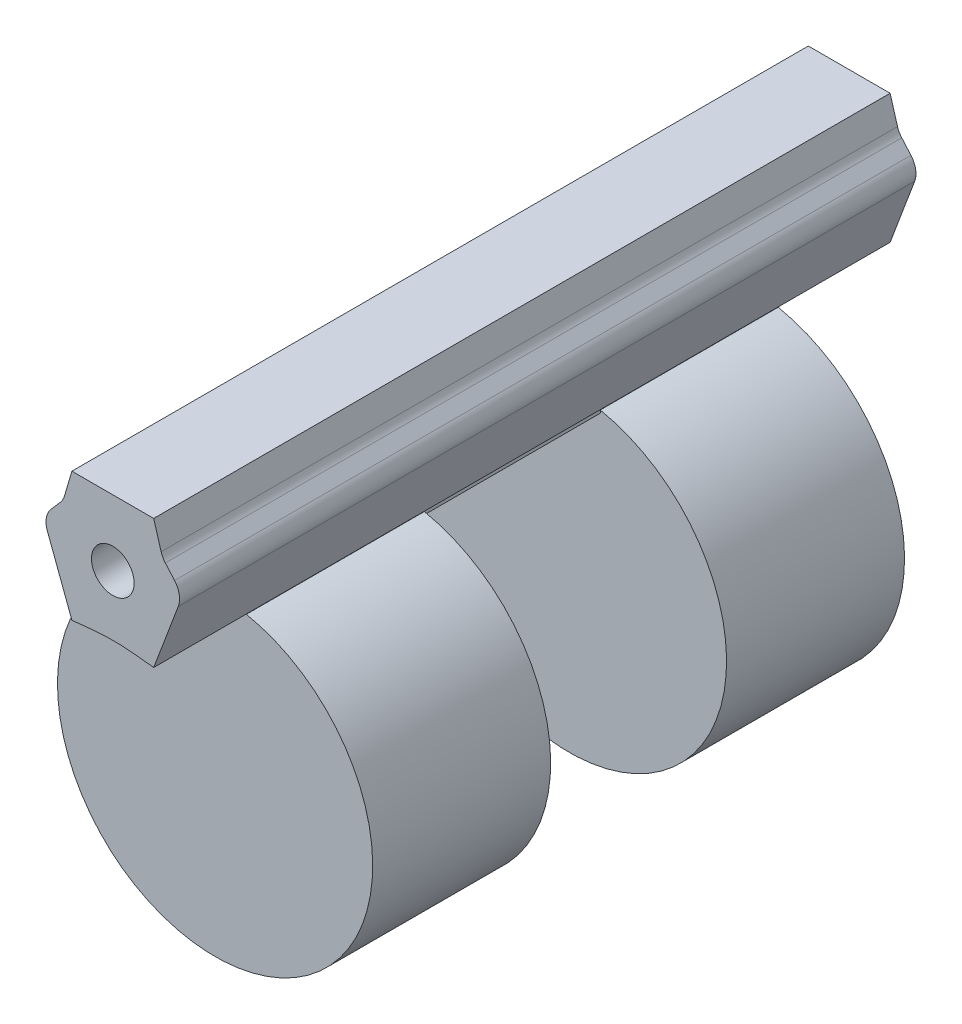
ISO-10303-21;
HEADER;
FILE_DESCRIPTION(('STEP AP214'),'2;1');
FILE_NAME('part.step','',(''),(''),'','','');
FILE_SCHEMA(('AUTOMOTIVE_DESIGN { 1 0 10303 214 1 1 1 1 }'));
ENDSEC;
DATA;
#1=APPLICATION_CONTEXT('core data for automotive mechanical design processes');
#2=APPLICATION_PROTOCOL_DEFINITION('international standard','automotive_design',2000,#1);
#3=PRODUCT_CONTEXT('',#1,'mechanical');
#4=PRODUCT('Part','Part','',(#3));
#5=PRODUCT_RELATED_PRODUCT_CATEGORY('part','',(#4));
#6=PRODUCT_DEFINITION_FORMATION('','',#4);
#7=PRODUCT_DEFINITION_CONTEXT('part definition',#1,'design');
#8=PRODUCT_DEFINITION('design','',#6,#7);
#9=PRODUCT_DEFINITION_SHAPE('','',#8);
#10=(LENGTH_UNIT() NAMED_UNIT(*) SI_UNIT(.MILLI.,.METRE.));
#11=(NAMED_UNIT(*) PLANE_ANGLE_UNIT() SI_UNIT($,.RADIAN.));
#12=(NAMED_UNIT(*) SI_UNIT($,.STERADIAN.) SOLID_ANGLE_UNIT());
#13=UNCERTAINTY_MEASURE_WITH_UNIT(LENGTH_MEASURE(1.E-05),#10,'distance_accuracy_value','');
#14=(GEOMETRIC_REPRESENTATION_CONTEXT(3) GLOBAL_UNCERTAINTY_ASSIGNED_CONTEXT((#13)) GLOBAL_UNIT_ASSIGNED_CONTEXT((#10,
#11,#12)) REPRESENTATION_CONTEXT('',''));
#15=CARTESIAN_POINT('',(0.,0.,0.));
#16=DIRECTION('',(0.,0.,1.));
#17=DIRECTION('',(1.,0.,0.));
#18=AXIS2_PLACEMENT_3D('',#15,#16,#17);
#19=CARTESIAN_POINT('',(0.,-0.424867387331251,-9.15));
#20=DIRECTION('',(0.,0.,1.));
#21=DIRECTION('',(1.,0.,0.));
#22=AXIS2_PLACEMENT_3D('',#19,#20,#21);
#23=CYLINDRICAL_SURFACE('',#22,7.98716984345149);
#24=DIRECTION('',(0.,0.,1.));
#25=VECTOR('',#24,1.);
#26=CARTESIAN_POINT('',(-1.52977779812018,7.41443500487939,-9.15));
#27=LINE('',#26,#25);
#28=CARTESIAN_POINT('',(-1.52977779812018,7.41443500487939,-12.95));
#29=VERTEX_POINT('',#28);
#30=CARTESIAN_POINT('',(-1.52977779812018,7.41443500487939,-4.35));
#31=VERTEX_POINT('',#30);
#32=EDGE_CURVE('E373',#29,#31,#27,.T.);
#33=ORIENTED_EDGE('',*,*,#32,.F.);
#34=CARTESIAN_POINT('',(0.,-0.424867387331251,-12.95));
#35=DIRECTION('',(0.,0.,-1.));
#36=DIRECTION('',(-1.,0.,0.));
#37=AXIS2_PLACEMENT_3D('',#34,#35,#36);
#38=CIRCLE('',#37,7.98716984345149);
#39=CARTESIAN_POINT('',(1.52977779812018,7.41443500487939,-12.95));
#40=VERTEX_POINT('',#39);
#41=EDGE_CURVE('E233',#29,#40,#38,.T.);
#42=ORIENTED_EDGE('',*,*,#41,.T.);
#43=DIRECTION('',(0.,0.,1.));
#44=VECTOR('',#43,1.);
#45=CARTESIAN_POINT('',(1.52977779812018,7.41443500487939,-9.15));
#46=LINE('',#45,#44);
#47=CARTESIAN_POINT('',(1.52977779812018,7.41443500487939,-4.35));
#48=VERTEX_POINT('',#47);
#49=EDGE_CURVE('E370',#40,#48,#46,.T.);
#50=ORIENTED_EDGE('',*,*,#49,.T.);
#51=CARTESIAN_POINT('',(0.,-0.424867387331251,-4.35));
#52=DIRECTION('',(0.,0.,1.));
#53=DIRECTION('',(1.,0.,0.));
#54=AXIS2_PLACEMENT_3D('',#51,#52,#53);
#55=CIRCLE('',#54,7.98716984345149);
#56=EDGE_CURVE('E387',#31,#48,#55,.F.);
#57=ORIENTED_EDGE('',*,*,#56,.F.);
#58=EDGE_LOOP('',(#33,#42,#50,#57));
#59=FACE_BOUND('',#58,.T.);
#60=ADVANCED_FACE('F41',(#59),#23,.F.);
#61=CARTESIAN_POINT('',(-1.52977779812018,7.55160942371748,-9.15));
#62=DIRECTION('',(-1.,0.,0.));
#63=DIRECTION('',(0.,0.,1.));
#64=AXIS2_PLACEMENT_3D('',#61,#62,#63);
#65=PLANE('',#64);
#66=DIRECTION('',(0.,-1.,0.));
#67=VECTOR('',#66,1.);
#68=CARTESIAN_POINT('',(-1.52977779812018,7.55160942371748,-21.65));
#69=LINE('',#68,#67);
#70=CARTESIAN_POINT('',(-1.52977779812018,8.0832210927319,-21.65));
#71=VERTEX_POINT('',#70);
#72=CARTESIAN_POINT('',(-1.52977779812018,7.55160942371748,-21.65));
#73=VERTEX_POINT('',#72);
#74=EDGE_CURVE('E211',#71,#73,#69,.T.);
#75=ORIENTED_EDGE('',*,*,#74,.T.);
#76=DIRECTION('',(0.,0.,-1.));
#77=VECTOR('',#76,1.);
#78=CARTESIAN_POINT('',(-1.52977779812018,7.55160942371748,-12.95));
#79=LINE('',#78,#77);
#80=CARTESIAN_POINT('',(-1.52977779812018,7.55160942371748,-12.95));
#81=VERTEX_POINT('',#80);
#82=EDGE_CURVE('E56',#73,#81,#79,.F.);
#83=ORIENTED_EDGE('',*,*,#82,.T.);
#84=DIRECTION('',(0.,-1.,0.));
#85=VECTOR('',#84,1.);
#86=CARTESIAN_POINT('',(-1.52977779812018,7.55160942371748,-12.95));
#87=LINE('',#86,#85);
#88=EDGE_CURVE('E60',#81,#29,#87,.T.);
#89=ORIENTED_EDGE('',*,*,#88,.T.);
#90=ORIENTED_EDGE('',*,*,#32,.T.);
#91=DIRECTION('',(0.,-1.,0.));
#92=VECTOR('',#91,1.);
#93=CARTESIAN_POINT('',(-1.52977779812018,0.,-4.35));
#94=LINE('',#93,#92);
#95=CARTESIAN_POINT('',(-1.52977779812018,7.55160942371748,-4.35));
#96=VERTEX_POINT('',#95);
#97=EDGE_CURVE('E382',#96,#31,#94,.T.);
#98=ORIENTED_EDGE('',*,*,#97,.F.);
#99=DIRECTION('',(0.,0.,1.));
#100=VECTOR('',#99,1.);
#101=CARTESIAN_POINT('',(-1.52977779812018,7.55160942371748,-4.35));
#102=LINE('',#101,#100);
#103=CARTESIAN_POINT('',(-1.52977779812018,7.55160942371748,4.35));
#104=VERTEX_POINT('',#103);
#105=EDGE_CURVE('E385',#96,#104,#102,.T.);
#106=ORIENTED_EDGE('',*,*,#105,.T.);
#107=DIRECTION('',(0.,-1.,0.));
#108=VECTOR('',#107,1.);
#109=CARTESIAN_POINT('',(-1.52977779812018,7.55160942371748,4.35));
#110=LINE('',#109,#108);
#111=CARTESIAN_POINT('',(-1.52977779812022,8.0832210927319,4.35));
#112=VERTEX_POINT('',#111);
#113=EDGE_CURVE('E366',#112,#104,#110,.T.);
#114=ORIENTED_EDGE('',*,*,#113,.F.);
#115=DIRECTION('',(0.,0.,1.));
#116=VECTOR('',#115,1.);
#117=CARTESIAN_POINT('',(-1.52977779812018,8.08322109273191,-9.15));
#118=LINE('',#117,#116);
#119=EDGE_CURVE('E375',#71,#112,#118,.T.);
#120=ORIENTED_EDGE('',*,*,#119,.F.);
#121=EDGE_LOOP('',(#75,#83,#89,#90,#98,#106,#114,#120));
#122=FACE_BOUND('',#121,.T.);
#123=ADVANCED_FACE('F428',(#122),#65,.T.);
#124=CARTESIAN_POINT('',(1.52977779812018,7.55160942371748,-9.15));
#125=DIRECTION('',(1.,0.,0.));
#126=DIRECTION('',(0.,0.,-1.));
#127=AXIS2_PLACEMENT_3D('',#124,#125,#126);
#128=PLANE('',#127);
#129=DIRECTION('',(0.,1.,0.));
#130=VECTOR('',#129,1.);
#131=CARTESIAN_POINT('',(1.52977779812018,7.55160942371748,-12.95));
#132=LINE('',#131,#130);
#133=CARTESIAN_POINT('',(1.52977779812018,7.55160942371748,-12.95));
#134=VERTEX_POINT('',#133);
#135=EDGE_CURVE('E11',#40,#134,#132,.T.);
#136=ORIENTED_EDGE('',*,*,#135,.T.);
#137=DIRECTION('',(0.,0.,-1.));
#138=VECTOR('',#137,1.);
#139=CARTESIAN_POINT('',(1.52977779812018,7.55160942371748,-12.95));
#140=LINE('',#139,#138);
#141=CARTESIAN_POINT('',(1.52977779812018,7.55160942371748,-21.65));
#142=VERTEX_POINT('',#141);
#143=EDGE_CURVE('E214',#134,#142,#140,.T.);
#144=ORIENTED_EDGE('',*,*,#143,.T.);
#145=DIRECTION('',(0.,1.,0.));
#146=VECTOR('',#145,1.);
#147=CARTESIAN_POINT('',(1.52977779812018,7.55160942371748,-21.65));
#148=LINE('',#147,#146);
#149=CARTESIAN_POINT('',(1.52977779812018,8.0832210927319,-21.65));
#150=VERTEX_POINT('',#149);
#151=EDGE_CURVE('E199',#142,#150,#148,.T.);
#152=ORIENTED_EDGE('',*,*,#151,.T.);
#153=DIRECTION('',(0.,0.,1.));
#154=VECTOR('',#153,1.);
#155=CARTESIAN_POINT('',(1.52977779812018,8.0832210927319,-9.15));
#156=LINE('',#155,#154);
#157=CARTESIAN_POINT('',(1.52977779812018,8.0832210927319,4.35));
#158=VERTEX_POINT('',#157);
#159=EDGE_CURVE('E369',#150,#158,#156,.T.);
#160=ORIENTED_EDGE('',*,*,#159,.T.);
#161=DIRECTION('',(0.,1.,0.));
#162=VECTOR('',#161,1.);
#163=CARTESIAN_POINT('',(1.52977779812018,7.55160942371748,4.35));
#164=LINE('',#163,#162);
#165=CARTESIAN_POINT('',(1.52977779812018,7.55160942371748,4.35));
#166=VERTEX_POINT('',#165);
#167=EDGE_CURVE('E363',#166,#158,#164,.T.);
#168=ORIENTED_EDGE('',*,*,#167,.F.);
#169=DIRECTION('',(0.,0.,1.));
#170=VECTOR('',#169,1.);
#171=CARTESIAN_POINT('',(1.52977779812018,7.55160942371748,-4.35));
#172=LINE('',#171,#170);
#173=CARTESIAN_POINT('',(1.52977779812018,7.55160942371748,-4.35));
#174=VERTEX_POINT('',#173);
#175=EDGE_CURVE('E380',#166,#174,#172,.F.);
#176=ORIENTED_EDGE('',*,*,#175,.T.);
#177=DIRECTION('',(0.,1.,0.));
#178=VECTOR('',#177,1.);
#179=CARTESIAN_POINT('',(1.52977779812018,0.,-4.35));
#180=LINE('',#179,#178);
#181=EDGE_CURVE('E372',#48,#174,#180,.T.);
#182=ORIENTED_EDGE('',*,*,#181,.F.);
#183=ORIENTED_EDGE('',*,*,#49,.F.);
#184=EDGE_LOOP('',(#136,#144,#152,#160,#168,#176,#182,#183));
#185=FACE_BOUND('',#184,.T.);
#186=ADVANCED_FACE('F215',(#185),#128,.T.);
#187=CARTESIAN_POINT('',(0.8377967255866,8.15431711081144,-9.15));
#188=DIRECTION('',(0.102204697049501,0.994763388902617,0.));
#189=DIRECTION('',(-0.994763388902617,0.102204697049501,0.));
#190=AXIS2_PLACEMENT_3D('',#187,#188,#189);
#191=PLANE('',#190);
#192=ORIENTED_EDGE('',*,*,#159,.F.);
#193=DIRECTION('',(0.994763388902617,-0.102204697049501,0.));
#194=VECTOR('',#193,1.);
#195=CARTESIAN_POINT('',(0.8377967255866,8.15431711081144,-21.65));
#196=LINE('',#195,#194);
#197=CARTESIAN_POINT('',(1.02204697049505,8.13538673935604,-21.65));
#198=VERTEX_POINT('',#197);
#199=EDGE_CURVE('E207',#198,#150,#196,.T.);
#200=ORIENTED_EDGE('',*,*,#199,.F.);
#201=DIRECTION('',(0.,0.,-1.));
#202=VECTOR('',#201,1.);
#203=CARTESIAN_POINT('',(1.02204697049505,8.13538673935604,-8.15));
#204=LINE('',#203,#202);
#205=CARTESIAN_POINT('',(1.02204697049505,8.13538673935604,-26.65));
#206=VERTEX_POINT('',#205);
#207=EDGE_CURVE('E282',#198,#206,#204,.T.);
#208=ORIENTED_EDGE('',*,*,#207,.T.);
#209=DIRECTION('',(-0.994763388902617,0.102204697049501,0.));
#210=VECTOR('',#209,1.);
#211=CARTESIAN_POINT('',(0.8377967255866,8.15431711081144,-26.65));
#212=LINE('',#211,#210);
#213=CARTESIAN_POINT('',(2.,8.03490918436735,-26.65));
#214=VERTEX_POINT('',#213);
#215=EDGE_CURVE('E258',#214,#206,#212,.T.);
#216=ORIENTED_EDGE('',*,*,#215,.F.);
#217=DIRECTION('',(0.,0.,1.));
#218=VECTOR('',#217,1.);
#219=CARTESIAN_POINT('',(2.,8.03490918436735,-9.15));
#220=LINE('',#219,#218);
#221=CARTESIAN_POINT('',(2.,8.03490918436735,9.35));
#222=VERTEX_POINT('',#221);
#223=EDGE_CURVE('E340',#214,#222,#220,.T.);
#224=ORIENTED_EDGE('',*,*,#223,.T.);
#225=DIRECTION('',(-0.994763388902617,0.102204697049501,0.));
#226=VECTOR('',#225,1.);
#227=CARTESIAN_POINT('',(0.8377967255866,8.15431711081144,9.35));
#228=LINE('',#227,#226);
#229=CARTESIAN_POINT('',(1.02204697049505,8.13538673935604,9.35));
#230=VERTEX_POINT('',#229);
#231=EDGE_CURVE('E310',#222,#230,#228,.T.);
#232=ORIENTED_EDGE('',*,*,#231,.T.);
#233=DIRECTION('',(0.,0.,1.));
#234=VECTOR('',#233,1.);
#235=CARTESIAN_POINT('',(1.02204697049505,8.13538673935604,-9.15));
#236=LINE('',#235,#234);
#237=CARTESIAN_POINT('',(1.02204697049505,8.13538673935604,4.35));
#238=VERTEX_POINT('',#237);
#239=EDGE_CURVE('E342',#238,#230,#236,.T.);
#240=ORIENTED_EDGE('',*,*,#239,.F.);
#241=DIRECTION('',(-0.994763388902617,0.102204697049501,0.));
#242=VECTOR('',#241,1.);
#243=CARTESIAN_POINT('',(0.8377967255866,8.15431711081144,4.35));
#244=LINE('',#243,#242);
#245=EDGE_CURVE('E360',#158,#238,#244,.T.);
#246=ORIENTED_EDGE('',*,*,#245,.F.);
#247=EDGE_LOOP('',(#192,#200,#208,#216,#224,#232,#240,#246));
#248=FACE_BOUND('',#247,.T.);
#249=ADVANCED_FACE('F413',(#248),#191,.F.);
#250=CARTESIAN_POINT('',(-0.8377967255866,8.15431711081144,-9.15));
#251=DIRECTION('',(0.102204697049501,-0.994763388902617,0.));
#252=DIRECTION('',(0.994763388902617,0.102204697049501,0.));
#253=AXIS2_PLACEMENT_3D('',#250,#251,#252);
#254=PLANE('',#253);
#255=DIRECTION('',(-0.994763388902617,-0.102204697049501,0.));
#256=VECTOR('',#255,1.);
#257=CARTESIAN_POINT('',(-0.8377967255866,8.15431711081144,-21.65));
#258=LINE('',#257,#256);
#259=CARTESIAN_POINT('',(-1.02204697049505,8.13538673935604,-21.65));
#260=VERTEX_POINT('',#259);
#261=EDGE_CURVE('E210',#260,#71,#258,.T.);
#262=ORIENTED_EDGE('',*,*,#261,.T.);
#263=ORIENTED_EDGE('',*,*,#119,.T.);
#264=DIRECTION('',(0.994763388902617,0.102204697049501,0.));
#265=VECTOR('',#264,1.);
#266=CARTESIAN_POINT('',(-0.8377967255866,8.15431711081144,4.35));
#267=LINE('',#266,#265);
#268=CARTESIAN_POINT('',(-1.02204697049505,8.13538673935604,4.35));
#269=VERTEX_POINT('',#268);
#270=EDGE_CURVE('E331',#112,#269,#267,.T.);
#271=ORIENTED_EDGE('',*,*,#270,.T.);
#272=DIRECTION('',(0.,0.,1.));
#273=VECTOR('',#272,1.);
#274=CARTESIAN_POINT('',(-1.02204697049505,8.13538673935604,-9.15));
#275=LINE('',#274,#273);
#276=CARTESIAN_POINT('',(-1.02204697049505,8.13538673935604,9.35));
#277=VERTEX_POINT('',#276);
#278=EDGE_CURVE('E344',#269,#277,#275,.T.);
#279=ORIENTED_EDGE('',*,*,#278,.T.);
#280=DIRECTION('',(0.994763388902617,0.102204697049501,0.));
#281=VECTOR('',#280,1.);
#282=CARTESIAN_POINT('',(-0.8377967255866,8.15431711081144,9.35));
#283=LINE('',#282,#281);
#284=CARTESIAN_POINT('',(-2.,8.03490918436735,9.35));
#285=VERTEX_POINT('',#284);
#286=EDGE_CURVE('E304',#285,#277,#283,.T.);
#287=ORIENTED_EDGE('',*,*,#286,.F.);
#288=DIRECTION('',(0.,0.,1.));
#289=VECTOR('',#288,1.);
#290=CARTESIAN_POINT('',(-2.,8.03490918436735,-9.15));
#291=LINE('',#290,#289);
#292=CARTESIAN_POINT('',(-2.,8.03490918436735,-26.65));
#293=VERTEX_POINT('',#292);
#294=EDGE_CURVE('E346',#293,#285,#291,.T.);
#295=ORIENTED_EDGE('',*,*,#294,.F.);
#296=DIRECTION('',(0.994763388902617,0.102204697049501,0.));
#297=VECTOR('',#296,1.);
#298=CARTESIAN_POINT('',(-0.8377967255866,8.15431711081144,-26.65));
#299=LINE('',#298,#297);
#300=CARTESIAN_POINT('',(-1.02204697049505,8.13538673935604,-26.65));
#301=VERTEX_POINT('',#300);
#302=EDGE_CURVE('E264',#293,#301,#299,.T.);
#303=ORIENTED_EDGE('',*,*,#302,.T.);
#304=DIRECTION('',(0.,0.,-1.));
#305=VECTOR('',#304,1.);
#306=CARTESIAN_POINT('',(-1.02204697049505,8.13538673935604,-8.15));
#307=LINE('',#306,#305);
#308=EDGE_CURVE('E283',#260,#301,#307,.T.);
#309=ORIENTED_EDGE('',*,*,#308,.F.);
#310=EDGE_LOOP('',(#262,#263,#271,#279,#287,#295,#303,#309));
#311=FACE_BOUND('',#310,.T.);
#312=ADVANCED_FACE('F401',(#311),#254,.T.);
#313=CARTESIAN_POINT('',(0.,-1.81224714967013,-8.15));
#314=DIRECTION('',(0.,0.,-1.));
#315=DIRECTION('',(-1.,0.,0.));
#316=AXIS2_PLACEMENT_3D('',#313,#314,#315);
#317=CYLINDRICAL_SURFACE('',#316,10.);
#318=CARTESIAN_POINT('',(0.,-1.81224714967013,-21.65));
#319=DIRECTION('',(0.,0.,1.));
#320=DIRECTION('',(1.,0.,0.));
#321=AXIS2_PLACEMENT_3D('',#318,#319,#320);
#322=CIRCLE('',#321,10.);
#323=EDGE_CURVE('E49',#260,#198,#322,.F.);
#324=ORIENTED_EDGE('',*,*,#323,.F.);
#325=ORIENTED_EDGE('',*,*,#308,.T.);
#326=CARTESIAN_POINT('',(0.,-1.81224714967013,-26.65));
#327=DIRECTION('',(0.,0.,1.));
#328=DIRECTION('',(1.,0.,0.));
#329=AXIS2_PLACEMENT_3D('',#326,#327,#328);
#330=CIRCLE('',#329,10.);
#331=EDGE_CURVE('E261',#301,#206,#330,.F.);
#332=ORIENTED_EDGE('',*,*,#331,.T.);
#333=ORIENTED_EDGE('',*,*,#207,.F.);
#334=EDGE_LOOP('',(#324,#325,#332,#333));
#335=FACE_BOUND('',#334,.T.);
#336=ADVANCED_FACE('F398',(#335),#317,.F.);
#337=CARTESIAN_POINT('',(0.,0.,4.35));
#338=DIRECTION('',(0.,0.,1.));
#339=DIRECTION('',(1.,0.,0.));
#340=AXIS2_PLACEMENT_3D('',#337,#338,#339);
#341=PLANE('',#340);
#342=ORIENTED_EDGE('',*,*,#167,.T.);
#343=ORIENTED_EDGE('',*,*,#245,.T.);
#344=CARTESIAN_POINT('',(0.,-1.81224714967013,4.35));
#345=DIRECTION('',(0.,0.,1.));
#346=DIRECTION('',(1.,0.,0.));
#347=AXIS2_PLACEMENT_3D('',#344,#345,#346);
#348=CIRCLE('',#347,10.);
#349=EDGE_CURVE('E358',#269,#238,#348,.F.);
#350=ORIENTED_EDGE('',*,*,#349,.F.);
#351=ORIENTED_EDGE('',*,*,#270,.F.);
#352=ORIENTED_EDGE('',*,*,#113,.T.);
#353=CARTESIAN_POINT('',(0.,0.,4.35));
#354=DIRECTION('',(0.,0.,1.));
#355=DIRECTION('',(1.,0.,0.));
#356=AXIS2_PLACEMENT_3D('',#353,#354,#355);
#357=CIRCLE('',#356,7.705);
#358=EDGE_CURVE('E390',#104,#166,#357,.T.);
#359=ORIENTED_EDGE('',*,*,#358,.T.);
#360=EDGE_LOOP('',(#342,#343,#350,#351,#352,#359));
#361=FACE_BOUND('',#360,.T.);
#362=ADVANCED_FACE('F424',(#361),#341,.T.);
#363=CARTESIAN_POINT('',(0.,0.,-4.35));
#364=DIRECTION('',(0.,0.,1.));
#365=DIRECTION('',(1.,0.,0.));
#366=AXIS2_PLACEMENT_3D('',#363,#364,#365);
#367=CYLINDRICAL_SURFACE('',#366,7.705);
#368=ORIENTED_EDGE('',*,*,#105,.F.);
#369=CARTESIAN_POINT('',(0.,0.,-4.35));
#370=DIRECTION('',(0.,0.,1.));
#371=DIRECTION('',(1.,0.,0.));
#372=AXIS2_PLACEMENT_3D('',#369,#370,#371);
#373=CIRCLE('',#372,7.705);
#374=EDGE_CURVE('E393',#96,#174,#373,.T.);
#375=ORIENTED_EDGE('',*,*,#374,.T.);
#376=ORIENTED_EDGE('',*,*,#175,.F.);
#377=ORIENTED_EDGE('',*,*,#358,.F.);
#378=EDGE_LOOP('',(#368,#375,#376,#377));
#379=FACE_BOUND('',#378,.T.);
#380=ADVANCED_FACE('F43',(#379),#367,.T.);
#381=CARTESIAN_POINT('',(0.,0.,-4.35));
#382=DIRECTION('',(0.,0.,1.));
#383=DIRECTION('',(1.,0.,0.));
#384=AXIS2_PLACEMENT_3D('',#381,#382,#383);
#385=PLANE('',#384);
#386=ORIENTED_EDGE('',*,*,#374,.F.);
#387=ORIENTED_EDGE('',*,*,#97,.T.);
#388=ORIENTED_EDGE('',*,*,#56,.T.);
#389=ORIENTED_EDGE('',*,*,#181,.T.);
#390=EDGE_LOOP('',(#386,#387,#388,#389));
#391=FACE_BOUND('',#390,.T.);
#392=ADVANCED_FACE('F430',(#391),#385,.F.);
#393=CARTESIAN_POINT('',(0.,14.3468581965453,-9.15));
#394=DIRECTION('',(0.,1.,0.));
#395=DIRECTION('',(0.,0.,1.));
#396=AXIS2_PLACEMENT_3D('',#393,#394,#395);
#397=PLANE('',#396);
#398=DIRECTION('',(0.,0.,1.));
#399=VECTOR('',#398,1.);
#400=CARTESIAN_POINT('',(-2.,14.3468581965453,-9.15));
#401=LINE('',#400,#399);
#402=CARTESIAN_POINT('',(-2.,14.3468581965453,-26.65));
#403=VERTEX_POINT('',#402);
#404=CARTESIAN_POINT('',(-2.,14.3468581965453,9.35));
#405=VERTEX_POINT('',#404);
#406=EDGE_CURVE('E328',#403,#405,#401,.T.);
#407=ORIENTED_EDGE('',*,*,#406,.T.);
#408=DIRECTION('',(-1.,0.,0.));
#409=VECTOR('',#408,1.);
#410=CARTESIAN_POINT('',(0.,14.3468581965453,9.35));
#411=LINE('',#410,#409);
#412=CARTESIAN_POINT('',(2.,14.3468581965453,9.35));
#413=VERTEX_POINT('',#412);
#414=EDGE_CURVE('E285',#413,#405,#411,.T.);
#415=ORIENTED_EDGE('',*,*,#414,.F.);
#416=DIRECTION('',(0.,0.,1.));
#417=VECTOR('',#416,1.);
#418=CARTESIAN_POINT('',(2.,14.3468581965453,-9.15));
#419=LINE('',#418,#417);
#420=CARTESIAN_POINT('',(2.,14.3468581965453,-26.65));
#421=VERTEX_POINT('',#420);
#422=EDGE_CURVE('E329',#421,#413,#419,.T.);
#423=ORIENTED_EDGE('',*,*,#422,.F.);
#424=DIRECTION('',(-1.,0.,0.));
#425=VECTOR('',#424,1.);
#426=CARTESIAN_POINT('',(0.,14.3468581965453,-26.65));
#427=LINE('',#426,#425);
#428=EDGE_CURVE('E240',#421,#403,#427,.T.);
#429=ORIENTED_EDGE('',*,*,#428,.T.);
#430=EDGE_LOOP('',(#407,#415,#423,#429));
#431=FACE_BOUND('',#430,.T.);
#432=ADVANCED_FACE('F443',(#431),#397,.T.);
#433=CARTESIAN_POINT('',(5.73763200767139,1.6950234919094,-9.15));
#434=DIRECTION('',(0.959026154052866,0.283317553008225,0.));
#435=DIRECTION('',(-0.283317553008225,0.959026154052866,0.));
#436=AXIS2_PLACEMENT_3D('',#433,#434,#435);
#437=PLANE('',#436);
#438=ORIENTED_EDGE('',*,*,#422,.T.);
#439=DIRECTION('',(-0.283317553008225,0.959026154052866,0.));
#440=VECTOR('',#439,1.);
#441=CARTESIAN_POINT('',(5.73763200767139,1.6950234919094,9.35));
#442=LINE('',#441,#440);
#443=CARTESIAN_POINT('',(2.36311709242603,13.1177116614202,9.35));
#444=VERTEX_POINT('',#443);
#445=EDGE_CURVE('E325',#444,#413,#442,.T.);
#446=ORIENTED_EDGE('',*,*,#445,.F.);
#447=DIRECTION('',(0.,0.,1.));
#448=VECTOR('',#447,1.);
#449=CARTESIAN_POINT('',(2.36311709242603,13.1177116614202,-9.15));
#450=LINE('',#449,#448);
#451=CARTESIAN_POINT('',(2.36311709242603,13.1177116614202,-26.65));
#452=VERTEX_POINT('',#451);
#453=EDGE_CURVE('E332',#452,#444,#450,.T.);
#454=ORIENTED_EDGE('',*,*,#453,.F.);
#455=DIRECTION('',(-0.283317553008225,0.959026154052866,0.));
#456=VECTOR('',#455,1.);
#457=CARTESIAN_POINT('',(5.73763200767139,1.6950234919094,-26.65));
#458=LINE('',#457,#456);
#459=EDGE_CURVE('E243',#452,#421,#458,.T.);
#460=ORIENTED_EDGE('',*,*,#459,.T.);
#461=EDGE_LOOP('',(#438,#446,#454,#460));
#462=FACE_BOUND('',#461,.T.);
#463=ADVANCED_FACE('F454',(#462),#437,.T.);
#464=CARTESIAN_POINT('',(3.3221432464789,13.4010292144284,-9.15));
#465=DIRECTION('',(0.,0.,1.));
#466=DIRECTION('',(1.,0.,0.));
#467=AXIS2_PLACEMENT_3D('',#464,#465,#466);
#468=CYLINDRICAL_SURFACE('',#467,1.);
#469=ORIENTED_EDGE('',*,*,#453,.T.);
#470=CARTESIAN_POINT('',(3.3221432464789,13.4010292144284,9.35));
#471=DIRECTION('',(0.,0.,1.));
#472=DIRECTION('',(1.,0.,0.));
#473=AXIS2_PLACEMENT_3D('',#470,#471,#472);
#474=CIRCLE('',#473,1.);
#475=CARTESIAN_POINT('',(2.56848254542367,12.7437655324217,9.35));
#476=VERTEX_POINT('',#475);
#477=EDGE_CURVE('E322',#476,#444,#474,.F.);
#478=ORIENTED_EDGE('',*,*,#477,.F.);
#479=DIRECTION('',(0.,0.,1.));
#480=VECTOR('',#479,1.);
#481=CARTESIAN_POINT('',(2.56848254542367,12.7437655324217,-9.15));
#482=LINE('',#481,#480);
#483=CARTESIAN_POINT('',(2.56848254542367,12.7437655324217,-26.65));
#484=VERTEX_POINT('',#483);
#485=EDGE_CURVE('E334',#484,#476,#482,.T.);
#486=ORIENTED_EDGE('',*,*,#485,.F.);
#487=CARTESIAN_POINT('',(3.3221432464789,13.4010292144284,-26.65));
#488=DIRECTION('',(0.,0.,1.));
#489=DIRECTION('',(1.,0.,0.));
#490=AXIS2_PLACEMENT_3D('',#487,#488,#489);
#491=CIRCLE('',#490,1.);
#492=EDGE_CURVE('E246',#484,#452,#491,.F.);
#493=ORIENTED_EDGE('',*,*,#492,.T.);
#494=EDGE_LOOP('',(#469,#478,#486,#493));
#495=FACE_BOUND('',#494,.T.);
#496=ADVANCED_FACE('F589',(#495),#468,.F.);
#497=CARTESIAN_POINT('',(7.77158229807316,6.77755757875835,-9.15));
#498=DIRECTION('',(0.753660701055234,0.657263682006646,0.));
#499=DIRECTION('',(-0.657263682006646,0.753660701055234,0.));
#500=AXIS2_PLACEMENT_3D('',#497,#498,#499);
#501=PLANE('',#500);
#502=ORIENTED_EDGE('',*,*,#485,.T.);
#503=DIRECTION('',(-0.657263682006646,0.753660701055234,0.));
#504=VECTOR('',#503,1.);
#505=CARTESIAN_POINT('',(7.77158229807316,6.77755757875835,9.35));
#506=LINE('',#505,#504);
#507=CARTESIAN_POINT('',(3.01793469521909,12.2283948652468,9.35));
#508=VERTEX_POINT('',#507);
#509=EDGE_CURVE('E319',#508,#476,#506,.T.);
#510=ORIENTED_EDGE('',*,*,#509,.F.);
#511=DIRECTION('',(0.,0.,1.));
#512=VECTOR('',#511,1.);
#513=CARTESIAN_POINT('',(3.01793469521909,12.2283948652468,-9.15));
#514=LINE('',#513,#512);
#515=CARTESIAN_POINT('',(3.01793469521909,12.2283948652468,-26.65));
#516=VERTEX_POINT('',#515);
#517=EDGE_CURVE('E336',#516,#508,#514,.T.);
#518=ORIENTED_EDGE('',*,*,#517,.F.);
#519=DIRECTION('',(-0.657263682006646,0.753660701055234,0.));
#520=VECTOR('',#519,1.);
#521=CARTESIAN_POINT('',(7.77158229807316,6.77755757875835,-26.65));
#522=LINE('',#521,#520);
#523=EDGE_CURVE('E249',#516,#484,#522,.T.);
#524=ORIENTED_EDGE('',*,*,#523,.T.);
#525=EDGE_LOOP('',(#502,#510,#518,#524));
#526=FACE_BOUND('',#525,.T.);
#527=ADVANCED_FACE('F578',(#526),#501,.T.);
#528=CARTESIAN_POINT('',(2.26427399416386,11.5711311832402,-9.15));
#529=DIRECTION('',(0.,0.,1.));
#530=DIRECTION('',(1.,0.,0.));
#531=AXIS2_PLACEMENT_3D('',#528,#529,#530);
#532=CYLINDRICAL_SURFACE('',#531,1.);
#533=ORIENTED_EDGE('',*,*,#517,.T.);
#534=CARTESIAN_POINT('',(2.26427399416386,11.5711311832402,9.35));
#535=DIRECTION('',(0.,0.,1.));
#536=DIRECTION('',(1.,0.,0.));
#537=AXIS2_PLACEMENT_3D('',#534,#535,#536);
#538=CIRCLE('',#537,1.);
#539=CARTESIAN_POINT('',(3.20000367654281,11.2184132201096,9.35));
#540=VERTEX_POINT('',#539);
#541=EDGE_CURVE('E316',#540,#508,#538,.T.);
#542=ORIENTED_EDGE('',*,*,#541,.F.);
#543=DIRECTION('',(0.,0.,1.));
#544=VECTOR('',#543,1.);
#545=CARTESIAN_POINT('',(3.20000367654281,11.2184132201096,-9.15));
#546=LINE('',#545,#544);
#547=CARTESIAN_POINT('',(3.20000367654281,11.2184132201096,-26.65));
#548=VERTEX_POINT('',#547);
#549=EDGE_CURVE('E338',#548,#540,#546,.T.);
#550=ORIENTED_EDGE('',*,*,#549,.F.);
#551=CARTESIAN_POINT('',(2.26427399416386,11.5711311832402,-26.65));
#552=DIRECTION('',(0.,0.,1.));
#553=DIRECTION('',(1.,0.,0.));
#554=AXIS2_PLACEMENT_3D('',#551,#552,#553);
#555=CIRCLE('',#554,1.);
#556=EDGE_CURVE('E252',#548,#516,#555,.T.);
#557=ORIENTED_EDGE('',*,*,#556,.T.);
#558=EDGE_LOOP('',(#533,#542,#550,#557));
#559=FACE_BOUND('',#558,.T.);
#560=ADVANCED_FACE('F567',(#559),#532,.T.);
#561=CARTESIAN_POINT('',(-0.900730993693953,0.339525407184472,-9.15));
#562=DIRECTION('',(0.935729682378953,-0.352717963130577,0.));
#563=DIRECTION('',(0.352717963130577,0.935729682378953,0.));
#564=AXIS2_PLACEMENT_3D('',#561,#562,#563);
#565=PLANE('',#564);
#566=ORIENTED_EDGE('',*,*,#549,.T.);
#567=DIRECTION('',(0.352717963130577,0.935729682378954,0.));
#568=VECTOR('',#567,1.);
#569=CARTESIAN_POINT('',(-0.900730993693953,0.339525407184472,9.35));
#570=LINE('',#569,#568);
#571=EDGE_CURVE('E313',#222,#540,#570,.T.);
#572=ORIENTED_EDGE('',*,*,#571,.F.);
#573=ORIENTED_EDGE('',*,*,#223,.F.);
#574=DIRECTION('',(0.352717963130577,0.935729682378954,0.));
#575=VECTOR('',#574,1.);
#576=CARTESIAN_POINT('',(-0.900730993693953,0.339525407184472,-26.65));
#577=LINE('',#576,#575);
#578=EDGE_CURVE('E255',#214,#548,#577,.T.);
#579=ORIENTED_EDGE('',*,*,#578,.T.);
#580=EDGE_LOOP('',(#566,#572,#573,#579));
#581=FACE_BOUND('',#580,.T.);
#582=ADVANCED_FACE('F563',(#581),#565,.T.);
#583=CARTESIAN_POINT('',(0.,-1.81224714967013,-9.15));
#584=DIRECTION('',(0.,0.,1.));
#585=DIRECTION('',(1.,0.,0.));
#586=AXIS2_PLACEMENT_3D('',#583,#584,#585);
#587=CYLINDRICAL_SURFACE('',#586,10.);
#588=ORIENTED_EDGE('',*,*,#278,.F.);
#589=ORIENTED_EDGE('',*,*,#349,.T.);
#590=ORIENTED_EDGE('',*,*,#239,.T.);
#591=CARTESIAN_POINT('',(0.,-1.81224714967013,9.35));
#592=DIRECTION('',(0.,0.,1.));
#593=DIRECTION('',(1.,0.,0.));
#594=AXIS2_PLACEMENT_3D('',#591,#592,#593);
#595=CIRCLE('',#594,10.);
#596=EDGE_CURVE('E307',#277,#230,#595,.F.);
#597=ORIENTED_EDGE('',*,*,#596,.F.);
#598=EDGE_LOOP('',(#588,#589,#590,#597));
#599=FACE_BOUND('',#598,.T.);
#600=ADVANCED_FACE('F554',(#599),#587,.F.);
#601=CARTESIAN_POINT('',(0.900730993693953,0.339525407184472,-9.15));
#602=DIRECTION('',(0.935729682378953,0.352717963130577,0.));
#603=DIRECTION('',(-0.352717963130577,0.935729682378953,0.));
#604=AXIS2_PLACEMENT_3D('',#601,#602,#603);
#605=PLANE('',#604);
#606=ORIENTED_EDGE('',*,*,#294,.T.);
#607=DIRECTION('',(-0.352717963130577,0.935729682378954,0.));
#608=VECTOR('',#607,1.);
#609=CARTESIAN_POINT('',(0.900730993693953,0.339525407184472,9.35));
#610=LINE('',#609,#608);
#611=CARTESIAN_POINT('',(-3.20000367654281,11.2184132201096,9.35));
#612=VERTEX_POINT('',#611);
#613=EDGE_CURVE('E301',#285,#612,#610,.T.);
#614=ORIENTED_EDGE('',*,*,#613,.T.);
#615=DIRECTION('',(0.,0.,1.));
#616=VECTOR('',#615,1.);
#617=CARTESIAN_POINT('',(-3.20000367654281,11.2184132201096,-9.15));
#618=LINE('',#617,#616);
#619=CARTESIAN_POINT('',(-3.20000367654281,11.2184132201096,-26.65));
#620=VERTEX_POINT('',#619);
#621=EDGE_CURVE('E348',#620,#612,#618,.T.);
#622=ORIENTED_EDGE('',*,*,#621,.F.);
#623=DIRECTION('',(-0.352717963130577,0.935729682378954,0.));
#624=VECTOR('',#623,1.);
#625=CARTESIAN_POINT('',(0.900730993693953,0.339525407184472,-26.65));
#626=LINE('',#625,#624);
#627=EDGE_CURVE('E267',#293,#620,#626,.T.);
#628=ORIENTED_EDGE('',*,*,#627,.F.);
#629=EDGE_LOOP('',(#606,#614,#622,#628));
#630=FACE_BOUND('',#629,.T.);
#631=ADVANCED_FACE('F543',(#630),#605,.F.);
#632=CARTESIAN_POINT('',(-2.26427399416386,11.5711311832402,-9.15));
#633=DIRECTION('',(0.,0.,1.));
#634=DIRECTION('',(1.,0.,0.));
#635=AXIS2_PLACEMENT_3D('',#632,#633,#634);
#636=CYLINDRICAL_SURFACE('',#635,1.);
#637=ORIENTED_EDGE('',*,*,#621,.T.);
#638=CARTESIAN_POINT('',(-2.26427399416386,11.5711311832402,9.35));
#639=DIRECTION('',(0.,0.,1.));
#640=DIRECTION('',(1.,0.,0.));
#641=AXIS2_PLACEMENT_3D('',#638,#639,#640);
#642=CIRCLE('',#641,1.);
#643=CARTESIAN_POINT('',(-3.01793469521909,12.2283948652468,9.35));
#644=VERTEX_POINT('',#643);
#645=EDGE_CURVE('E298',#612,#644,#642,.F.);
#646=ORIENTED_EDGE('',*,*,#645,.T.);
#647=DIRECTION('',(0.,0.,1.));
#648=VECTOR('',#647,1.);
#649=CARTESIAN_POINT('',(-3.01793469521909,12.2283948652468,-9.15));
#650=LINE('',#649,#648);
#651=CARTESIAN_POINT('',(-3.01793469521909,12.2283948652468,-26.65));
#652=VERTEX_POINT('',#651);
#653=EDGE_CURVE('E350',#652,#644,#650,.T.);
#654=ORIENTED_EDGE('',*,*,#653,.F.);
#655=CARTESIAN_POINT('',(-2.26427399416386,11.5711311832402,-26.65));
#656=DIRECTION('',(0.,0.,1.));
#657=DIRECTION('',(1.,0.,0.));
#658=AXIS2_PLACEMENT_3D('',#655,#656,#657);
#659=CIRCLE('',#658,1.);
#660=EDGE_CURVE('E270',#620,#652,#659,.F.);
#661=ORIENTED_EDGE('',*,*,#660,.F.);
#662=EDGE_LOOP('',(#637,#646,#654,#661));
#663=FACE_BOUND('',#662,.T.);
#664=ADVANCED_FACE('F532',(#663),#636,.T.);
#665=CARTESIAN_POINT('',(-7.77158229807316,6.77755757875835,-9.15));
#666=DIRECTION('',(0.753660701055234,-0.657263682006646,0.));
#667=DIRECTION('',(0.657263682006646,0.753660701055234,0.));
#668=AXIS2_PLACEMENT_3D('',#665,#666,#667);
#669=PLANE('',#668);
#670=ORIENTED_EDGE('',*,*,#653,.T.);
#671=DIRECTION('',(0.657263682006646,0.753660701055234,0.));
#672=VECTOR('',#671,1.);
#673=CARTESIAN_POINT('',(-7.77158229807316,6.77755757875835,9.35));
#674=LINE('',#673,#672);
#675=CARTESIAN_POINT('',(-2.56848254542367,12.7437655324217,9.35));
#676=VERTEX_POINT('',#675);
#677=EDGE_CURVE('E295',#644,#676,#674,.T.);
#678=ORIENTED_EDGE('',*,*,#677,.T.);
#679=DIRECTION('',(0.,0.,1.));
#680=VECTOR('',#679,1.);
#681=CARTESIAN_POINT('',(-2.56848254542367,12.7437655324217,-9.15));
#682=LINE('',#681,#680);
#683=CARTESIAN_POINT('',(-2.56848254542367,12.7437655324217,-26.65));
#684=VERTEX_POINT('',#683);
#685=EDGE_CURVE('E352',#684,#676,#682,.T.);
#686=ORIENTED_EDGE('',*,*,#685,.F.);
#687=DIRECTION('',(0.657263682006646,0.753660701055234,0.));
#688=VECTOR('',#687,1.);
#689=CARTESIAN_POINT('',(-7.77158229807316,6.77755757875835,-26.65));
#690=LINE('',#689,#688);
#691=EDGE_CURVE('E273',#652,#684,#690,.T.);
#692=ORIENTED_EDGE('',*,*,#691,.F.);
#693=EDGE_LOOP('',(#670,#678,#686,#692));
#694=FACE_BOUND('',#693,.T.);
#695=ADVANCED_FACE('F521',(#694),#669,.F.);
#696=CARTESIAN_POINT('',(-3.3221432464789,13.4010292144284,-9.15));
#697=DIRECTION('',(0.,0.,1.));
#698=DIRECTION('',(1.,0.,0.));
#699=AXIS2_PLACEMENT_3D('',#696,#697,#698);
#700=CYLINDRICAL_SURFACE('',#699,1.);
#701=ORIENTED_EDGE('',*,*,#685,.T.);
#702=CARTESIAN_POINT('',(-3.3221432464789,13.4010292144284,9.35));
#703=DIRECTION('',(0.,0.,1.));
#704=DIRECTION('',(1.,0.,0.));
#705=AXIS2_PLACEMENT_3D('',#702,#703,#704);
#706=CIRCLE('',#705,1.);
#707=CARTESIAN_POINT('',(-2.36311709242603,13.1177116614202,9.35));
#708=VERTEX_POINT('',#707);
#709=EDGE_CURVE('E292',#676,#708,#706,.T.);
#710=ORIENTED_EDGE('',*,*,#709,.T.);
#711=DIRECTION('',(0.,0.,1.));
#712=VECTOR('',#711,1.);
#713=CARTESIAN_POINT('',(-2.36311709242603,13.1177116614202,-9.15));
#714=LINE('',#713,#712);
#715=CARTESIAN_POINT('',(-2.36311709242603,13.1177116614202,-26.65));
#716=VERTEX_POINT('',#715);
#717=EDGE_CURVE('E354',#716,#708,#714,.T.);
#718=ORIENTED_EDGE('',*,*,#717,.F.);
#719=CARTESIAN_POINT('',(-3.3221432464789,13.4010292144284,-26.65));
#720=DIRECTION('',(0.,0.,1.));
#721=DIRECTION('',(1.,0.,0.));
#722=AXIS2_PLACEMENT_3D('',#719,#720,#721);
#723=CIRCLE('',#722,1.);
#724=EDGE_CURVE('E276',#684,#716,#723,.T.);
#725=ORIENTED_EDGE('',*,*,#724,.F.);
#726=EDGE_LOOP('',(#701,#710,#718,#725));
#727=FACE_BOUND('',#726,.T.);
#728=ADVANCED_FACE('F509',(#727),#700,.F.);
#729=CARTESIAN_POINT('',(-5.73763200767139,1.6950234919094,-9.15));
#730=DIRECTION('',(0.959026154052866,-0.283317553008225,0.));
#731=DIRECTION('',(0.283317553008225,0.959026154052866,0.));
#732=AXIS2_PLACEMENT_3D('',#729,#730,#731);
#733=PLANE('',#732);
#734=ORIENTED_EDGE('',*,*,#717,.T.);
#735=DIRECTION('',(0.283317553008225,0.959026154052866,0.));
#736=VECTOR('',#735,1.);
#737=CARTESIAN_POINT('',(-5.73763200767139,1.6950234919094,9.35));
#738=LINE('',#737,#736);
#739=EDGE_CURVE('E289',#708,#405,#738,.T.);
#740=ORIENTED_EDGE('',*,*,#739,.T.);
#741=ORIENTED_EDGE('',*,*,#406,.F.);
#742=DIRECTION('',(0.283317553008225,0.959026154052866,0.));
#743=VECTOR('',#742,1.);
#744=CARTESIAN_POINT('',(-5.73763200767139,1.6950234919094,-26.65));
#745=LINE('',#744,#743);
#746=EDGE_CURVE('E279',#716,#403,#745,.T.);
#747=ORIENTED_EDGE('',*,*,#746,.F.);
#748=EDGE_LOOP('',(#734,#740,#741,#747));
#749=FACE_BOUND('',#748,.T.);
#750=ADVANCED_FACE('F503',(#749),#733,.F.);
#751=CARTESIAN_POINT('',(0.,0.,9.35));
#752=DIRECTION('',(0.,0.,1.));
#753=DIRECTION('',(1.,0.,0.));
#754=AXIS2_PLACEMENT_3D('',#751,#752,#753);
#755=PLANE('',#754);
#756=CARTESIAN_POINT('',(0.,11.1261699757614,9.35));
#757=DIRECTION('',(0.,0.,1.));
#758=DIRECTION('',(1.,0.,0.));
#759=AXIS2_PLACEMENT_3D('',#756,#757,#758);
#760=CIRCLE('',#759,1.0427123321785);
#761=CARTESIAN_POINT('',(1.0427123321785,11.1261699757614,9.35));
#762=VERTEX_POINT('',#761);
#763=EDGE_CURVE('E228',#762,#762,#760,.T.);
#764=ORIENTED_EDGE('',*,*,#763,.F.);
#765=EDGE_LOOP('',(#764));
#766=FACE_BOUND('',#765,.T.);
#767=ORIENTED_EDGE('',*,*,#414,.T.);
#768=ORIENTED_EDGE('',*,*,#739,.F.);
#769=ORIENTED_EDGE('',*,*,#709,.F.);
#770=ORIENTED_EDGE('',*,*,#677,.F.);
#771=ORIENTED_EDGE('',*,*,#645,.F.);
#772=ORIENTED_EDGE('',*,*,#613,.F.);
#773=ORIENTED_EDGE('',*,*,#286,.T.);
#774=ORIENTED_EDGE('',*,*,#596,.T.);
#775=ORIENTED_EDGE('',*,*,#231,.F.);
#776=ORIENTED_EDGE('',*,*,#571,.T.);
#777=ORIENTED_EDGE('',*,*,#541,.T.);
#778=ORIENTED_EDGE('',*,*,#509,.T.);
#779=ORIENTED_EDGE('',*,*,#477,.T.);
#780=ORIENTED_EDGE('',*,*,#445,.T.);
#781=EDGE_LOOP('',(#767,#768,#769,#770,#771,#772,#773,#774,#775,#776,#777,#778,#779,#780));
#782=FACE_BOUND('',#781,.T.);
#783=ADVANCED_FACE('F508',(#766,#782),#755,.T.);
#784=CARTESIAN_POINT('',(0.,0.,-26.65));
#785=DIRECTION('',(0.,0.,-1.));
#786=DIRECTION('',(1.,0.,0.));
#787=AXIS2_PLACEMENT_3D('',#784,#785,#786);
#788=PLANE('',#787);
#789=CARTESIAN_POINT('',(0.,11.1261699757614,-26.65));
#790=DIRECTION('',(0.,0.,1.));
#791=DIRECTION('',(1.,0.,0.));
#792=AXIS2_PLACEMENT_3D('',#789,#790,#791);
#793=CIRCLE('',#792,1.0427123321785);
#794=CARTESIAN_POINT('',(1.0427123321785,11.1261699757614,-26.65));
#795=VERTEX_POINT('',#794);
#796=EDGE_CURVE('E704',#795,#795,#793,.T.);
#797=ORIENTED_EDGE('',*,*,#796,.T.);
#798=EDGE_LOOP('',(#797));
#799=FACE_BOUND('',#798,.T.);
#800=ORIENTED_EDGE('',*,*,#428,.F.);
#801=ORIENTED_EDGE('',*,*,#459,.F.);
#802=ORIENTED_EDGE('',*,*,#492,.F.);
#803=ORIENTED_EDGE('',*,*,#523,.F.);
#804=ORIENTED_EDGE('',*,*,#556,.F.);
#805=ORIENTED_EDGE('',*,*,#578,.F.);
#806=ORIENTED_EDGE('',*,*,#215,.T.);
#807=ORIENTED_EDGE('',*,*,#331,.F.);
#808=ORIENTED_EDGE('',*,*,#302,.F.);
#809=ORIENTED_EDGE('',*,*,#627,.T.);
#810=ORIENTED_EDGE('',*,*,#660,.T.);
#811=ORIENTED_EDGE('',*,*,#691,.T.);
#812=ORIENTED_EDGE('',*,*,#724,.T.);
#813=ORIENTED_EDGE('',*,*,#746,.T.);
#814=EDGE_LOOP('',(#800,#801,#802,#803,#804,#805,#806,#807,#808,#809,#810,#811,#812,#813));
#815=FACE_BOUND('',#814,.T.);
#816=ADVANCED_FACE('F407',(#799,#815),#788,.T.);
#817=CARTESIAN_POINT('',(0.,-0.424867387331251,-21.65));
#818=DIRECTION('',(0.,0.,1.));
#819=DIRECTION('',(-1.,0.,0.));
#820=AXIS2_PLACEMENT_3D('',#817,#818,#819);
#821=PLANE('',#820);
#822=ORIENTED_EDGE('',*,*,#151,.F.);
#823=CARTESIAN_POINT('',(0.,0.,-21.65));
#824=DIRECTION('',(0.,0.,1.));
#825=DIRECTION('',(1.,0.,0.));
#826=AXIS2_PLACEMENT_3D('',#823,#824,#825);
#827=CIRCLE('',#826,7.705);
#828=EDGE_CURVE('E204',#73,#142,#827,.T.);
#829=ORIENTED_EDGE('',*,*,#828,.F.);
#830=ORIENTED_EDGE('',*,*,#74,.F.);
#831=ORIENTED_EDGE('',*,*,#261,.F.);
#832=ORIENTED_EDGE('',*,*,#323,.T.);
#833=ORIENTED_EDGE('',*,*,#199,.T.);
#834=EDGE_LOOP('',(#822,#829,#830,#831,#832,#833));
#835=FACE_BOUND('',#834,.T.);
#836=ADVANCED_FACE('F201',(#835),#821,.F.);
#837=CARTESIAN_POINT('',(0.,0.,-12.95));
#838=DIRECTION('',(0.,0.,-1.));
#839=DIRECTION('',(-1.,0.,0.));
#840=AXIS2_PLACEMENT_3D('',#837,#838,#839);
#841=CYLINDRICAL_SURFACE('',#840,7.705);
#842=ORIENTED_EDGE('',*,*,#82,.F.);
#843=ORIENTED_EDGE('',*,*,#828,.T.);
#844=ORIENTED_EDGE('',*,*,#143,.F.);
#845=CARTESIAN_POINT('',(0.,0.,-12.95));
#846=DIRECTION('',(0.,0.,1.));
#847=DIRECTION('',(1.,0.,0.));
#848=AXIS2_PLACEMENT_3D('',#845,#846,#847);
#849=CIRCLE('',#848,7.705);
#850=EDGE_CURVE('E221',#81,#134,#849,.T.);
#851=ORIENTED_EDGE('',*,*,#850,.F.);
#852=EDGE_LOOP('',(#842,#843,#844,#851));
#853=FACE_BOUND('',#852,.T.);
#854=ADVANCED_FACE('F223',(#853),#841,.T.);
#855=CARTESIAN_POINT('',(0.,0.,-12.95));
#856=DIRECTION('',(0.,0.,-1.));
#857=DIRECTION('',(1.,0.,0.));
#858=AXIS2_PLACEMENT_3D('',#855,#856,#857);
#859=PLANE('',#858);
#860=ORIENTED_EDGE('',*,*,#88,.F.);
#861=ORIENTED_EDGE('',*,*,#850,.T.);
#862=ORIENTED_EDGE('',*,*,#135,.F.);
#863=ORIENTED_EDGE('',*,*,#41,.F.);
#864=EDGE_LOOP('',(#860,#861,#862,#863));
#865=FACE_BOUND('',#864,.T.);
#866=ADVANCED_FACE('F435',(#865),#859,.F.);
#867=CARTESIAN_POINT('',(0.,11.1261699757614,6.85));
#868=DIRECTION('',(0.,0.,1.));
#869=DIRECTION('',(1.,0.,0.));
#870=AXIS2_PLACEMENT_3D('',#867,#868,#869);
#871=CYLINDRICAL_SURFACE('',#870,1.0427123321785);
#872=CARTESIAN_POINT('',(0.,11.1261699757614,6.85));
#873=DIRECTION('',(0.,0.,1.));
#874=DIRECTION('',(1.,0.,0.));
#875=AXIS2_PLACEMENT_3D('',#872,#873,#874);
#876=CIRCLE('',#875,1.0427123321785);
#877=CARTESIAN_POINT('',(1.0427123321785,11.1261699757614,6.85));
#878=VERTEX_POINT('',#877);
#879=EDGE_CURVE('E224',#878,#878,#876,.T.);
#880=ORIENTED_EDGE('',*,*,#879,.F.);
#881=EDGE_LOOP('',(#880));
#882=FACE_BOUND('',#881,.T.);
#883=ORIENTED_EDGE('',*,*,#763,.T.);
#884=EDGE_LOOP('',(#883));
#885=FACE_BOUND('',#884,.T.);
#886=ADVANCED_FACE('F684',(#882,#885),#871,.F.);
#887=CARTESIAN_POINT('',(0.,11.1261699757614,6.85));
#888=DIRECTION('',(0.,0.,1.));
#889=DIRECTION('',(1.,0.,0.));
#890=AXIS2_PLACEMENT_3D('',#887,#888,#889);
#891=PLANE('',#890);
#892=ORIENTED_EDGE('',*,*,#879,.T.);
#893=EDGE_LOOP('',(#892));
#894=FACE_BOUND('',#893,.T.);
#895=ADVANCED_FACE('F687',(#894),#891,.T.);
#896=CARTESIAN_POINT('',(0.,11.1261699757614,-24.15));
#897=DIRECTION('',(0.,0.,-1.));
#898=DIRECTION('',(-1.,0.,0.));
#899=AXIS2_PLACEMENT_3D('',#896,#897,#898);
#900=CYLINDRICAL_SURFACE('',#899,1.0427123321785);
#901=CARTESIAN_POINT('',(0.,11.1261699757614,-24.15));
#902=DIRECTION('',(0.,0.,1.));
#903=DIRECTION('',(1.,0.,0.));
#904=AXIS2_PLACEMENT_3D('',#901,#902,#903);
#905=CIRCLE('',#904,1.0427123321785);
#906=CARTESIAN_POINT('',(1.0427123321785,11.1261699757614,-24.15));
#907=VERTEX_POINT('',#906);
#908=EDGE_CURVE('E703',#907,#907,#905,.T.);
#909=ORIENTED_EDGE('',*,*,#908,.T.);
#910=EDGE_LOOP('',(#909));
#911=FACE_BOUND('',#910,.T.);
#912=ORIENTED_EDGE('',*,*,#796,.F.);
#913=EDGE_LOOP('',(#912));
#914=FACE_BOUND('',#913,.T.);
#915=ADVANCED_FACE('F691',(#911,#914),#900,.F.);
#916=CARTESIAN_POINT('',(0.,11.1261699757614,-24.15));
#917=DIRECTION('',(0.,0.,-1.));
#918=DIRECTION('',(1.,0.,0.));
#919=AXIS2_PLACEMENT_3D('',#916,#917,#918);
#920=PLANE('',#919);
#921=ORIENTED_EDGE('',*,*,#908,.F.);
#922=EDGE_LOOP('',(#921));
#923=FACE_BOUND('',#922,.T.);
#924=ADVANCED_FACE('F695',(#923),#920,.T.);
#925=CLOSED_SHELL('',(#60,#123,#186,#249,#312,#336,#362,#380,#392,#432,#463,#496,#527,#560,#582,
#600,#631,#664,#695,#728,#750,#783,#816,#836,#854,#866,#886,#895,#915,#924));
#926=MANIFOLD_SOLID_BREP('B2',#925);
#927=ADVANCED_BREP_SHAPE_REPRESENTATION('',(#18,#926),#14);
#928=SHAPE_DEFINITION_REPRESENTATION(#9,#927);
ENDSEC;
END-ISO-10303-21;
